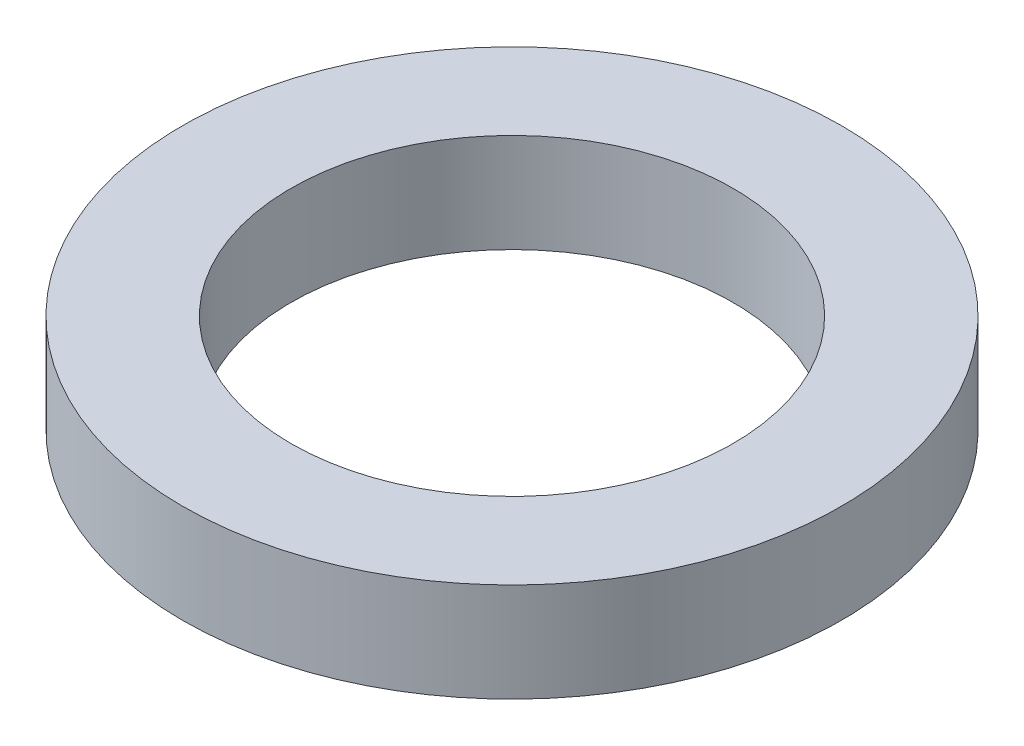
ISO-10303-21;
HEADER;
FILE_DESCRIPTION(('STEP AP214'),'2;1');
FILE_NAME('part.step','',(''),(''),'','','');
FILE_SCHEMA(('AUTOMOTIVE_DESIGN { 1 0 10303 214 1 1 1 1 }'));
ENDSEC;
DATA;
#1=APPLICATION_CONTEXT('core data for automotive mechanical design processes');
#2=APPLICATION_PROTOCOL_DEFINITION('international standard','automotive_design',2000,#1);
#3=PRODUCT_CONTEXT('',#1,'mechanical');
#4=PRODUCT('Part','Part','',(#3));
#5=PRODUCT_RELATED_PRODUCT_CATEGORY('part','',(#4));
#6=PRODUCT_DEFINITION_FORMATION('','',#4);
#7=PRODUCT_DEFINITION_CONTEXT('part definition',#1,'design');
#8=PRODUCT_DEFINITION('design','',#6,#7);
#9=PRODUCT_DEFINITION_SHAPE('','',#8);
#10=(LENGTH_UNIT() NAMED_UNIT(*) SI_UNIT(.MILLI.,.METRE.));
#11=(NAMED_UNIT(*) PLANE_ANGLE_UNIT() SI_UNIT($,.RADIAN.));
#12=(NAMED_UNIT(*) SI_UNIT($,.STERADIAN.) SOLID_ANGLE_UNIT());
#13=UNCERTAINTY_MEASURE_WITH_UNIT(LENGTH_MEASURE(1.E-05),#10,'distance_accuracy_value','');
#14=(GEOMETRIC_REPRESENTATION_CONTEXT(3) GLOBAL_UNCERTAINTY_ASSIGNED_CONTEXT((#13)) GLOBAL_UNIT_ASSIGNED_CONTEXT((#10,
#11,#12)) REPRESENTATION_CONTEXT('',''));
#15=CARTESIAN_POINT('',(0.,0.,0.));
#16=DIRECTION('',(0.,0.,1.));
#17=DIRECTION('',(1.,0.,0.));
#18=AXIS2_PLACEMENT_3D('',#15,#16,#17);
#19=CARTESIAN_POINT('',(0.,0.,0.));
#20=DIRECTION('',(0.,1.,0.));
#21=DIRECTION('',(0.,0.,1.));
#22=AXIS2_PLACEMENT_3D('',#19,#20,#21);
#23=CYLINDRICAL_SURFACE('',#22,4.025);
#24=CARTESIAN_POINT('',(0.,1.8,0.));
#25=DIRECTION('',(0.,1.,0.));
#26=DIRECTION('',(0.,0.,1.));
#27=AXIS2_PLACEMENT_3D('',#24,#25,#26);
#28=CIRCLE('',#27,4.025);
#29=CARTESIAN_POINT('',(0.,1.8,4.025));
#30=VERTEX_POINT('',#29);
#31=EDGE_CURVE('E10',#30,#30,#28,.T.);
#32=ORIENTED_EDGE('',*,*,#31,.T.);
#33=EDGE_LOOP('',(#32));
#34=FACE_BOUND('',#33,.T.);
#35=CARTESIAN_POINT('',(0.,0.,0.));
#36=DIRECTION('',(0.,1.,0.));
#37=DIRECTION('',(0.,0.,1.));
#38=AXIS2_PLACEMENT_3D('',#35,#36,#37);
#39=CIRCLE('',#38,4.025);
#40=CARTESIAN_POINT('',(0.,0.,4.025));
#41=VERTEX_POINT('',#40);
#42=EDGE_CURVE('E55',#41,#41,#39,.T.);
#43=ORIENTED_EDGE('',*,*,#42,.F.);
#44=EDGE_LOOP('',(#43));
#45=FACE_BOUND('',#44,.T.);
#46=ADVANCED_FACE('F41',(#34,#45),#23,.F.);
#47=CARTESIAN_POINT('',(4.025,1.8,0.));
#48=DIRECTION('',(0.,1.,0.));
#49=DIRECTION('',(0.,0.,1.));
#50=AXIS2_PLACEMENT_3D('',#47,#48,#49);
#51=PLANE('',#50);
#52=CARTESIAN_POINT('',(0.,1.8,0.));
#53=DIRECTION('',(0.,1.,0.));
#54=DIRECTION('',(0.,0.,1.));
#55=AXIS2_PLACEMENT_3D('',#52,#53,#54);
#56=CIRCLE('',#55,6.);
#57=CARTESIAN_POINT('',(0.,1.8,6.));
#58=VERTEX_POINT('',#57);
#59=EDGE_CURVE('E47',#58,#58,#56,.T.);
#60=ORIENTED_EDGE('',*,*,#59,.T.);
#61=EDGE_LOOP('',(#60));
#62=FACE_BOUND('',#61,.T.);
#63=ORIENTED_EDGE('',*,*,#31,.F.);
#64=EDGE_LOOP('',(#63));
#65=FACE_BOUND('',#64,.T.);
#66=ADVANCED_FACE('F65',(#62,#65),#51,.T.);
#67=CARTESIAN_POINT('',(0.,0.,0.));
#68=DIRECTION('',(0.,1.,0.));
#69=DIRECTION('',(0.,0.,1.));
#70=AXIS2_PLACEMENT_3D('',#67,#68,#69);
#71=CYLINDRICAL_SURFACE('',#70,6.);
#72=CARTESIAN_POINT('',(0.,0.,0.));
#73=DIRECTION('',(0.,1.,0.));
#74=DIRECTION('',(0.,0.,1.));
#75=AXIS2_PLACEMENT_3D('',#72,#73,#74);
#76=CIRCLE('',#75,6.);
#77=CARTESIAN_POINT('',(0.,0.,6.));
#78=VERTEX_POINT('',#77);
#79=EDGE_CURVE('E51',#78,#78,#76,.T.);
#80=ORIENTED_EDGE('',*,*,#79,.T.);
#81=EDGE_LOOP('',(#80));
#82=FACE_BOUND('',#81,.T.);
#83=ORIENTED_EDGE('',*,*,#59,.F.);
#84=EDGE_LOOP('',(#83));
#85=FACE_BOUND('',#84,.T.);
#86=ADVANCED_FACE('F69',(#82,#85),#71,.T.);
#87=CARTESIAN_POINT('',(6.,0.,0.));
#88=DIRECTION('',(0.,-1.,0.));
#89=DIRECTION('',(0.,0.,-1.));
#90=AXIS2_PLACEMENT_3D('',#87,#88,#89);
#91=PLANE('',#90);
#92=ORIENTED_EDGE('',*,*,#42,.T.);
#93=EDGE_LOOP('',(#92));
#94=FACE_BOUND('',#93,.T.);
#95=ORIENTED_EDGE('',*,*,#79,.F.);
#96=EDGE_LOOP('',(#95));
#97=FACE_BOUND('',#96,.T.);
#98=ADVANCED_FACE('F61',(#94,#97),#91,.T.);
#99=CLOSED_SHELL('',(#46,#66,#86,#98));
#100=MANIFOLD_SOLID_BREP('B2',#99);
#101=ADVANCED_BREP_SHAPE_REPRESENTATION('',(#18,#100),#14);
#102=SHAPE_DEFINITION_REPRESENTATION(#9,#101);
ENDSEC;
END-ISO-10303-21;
